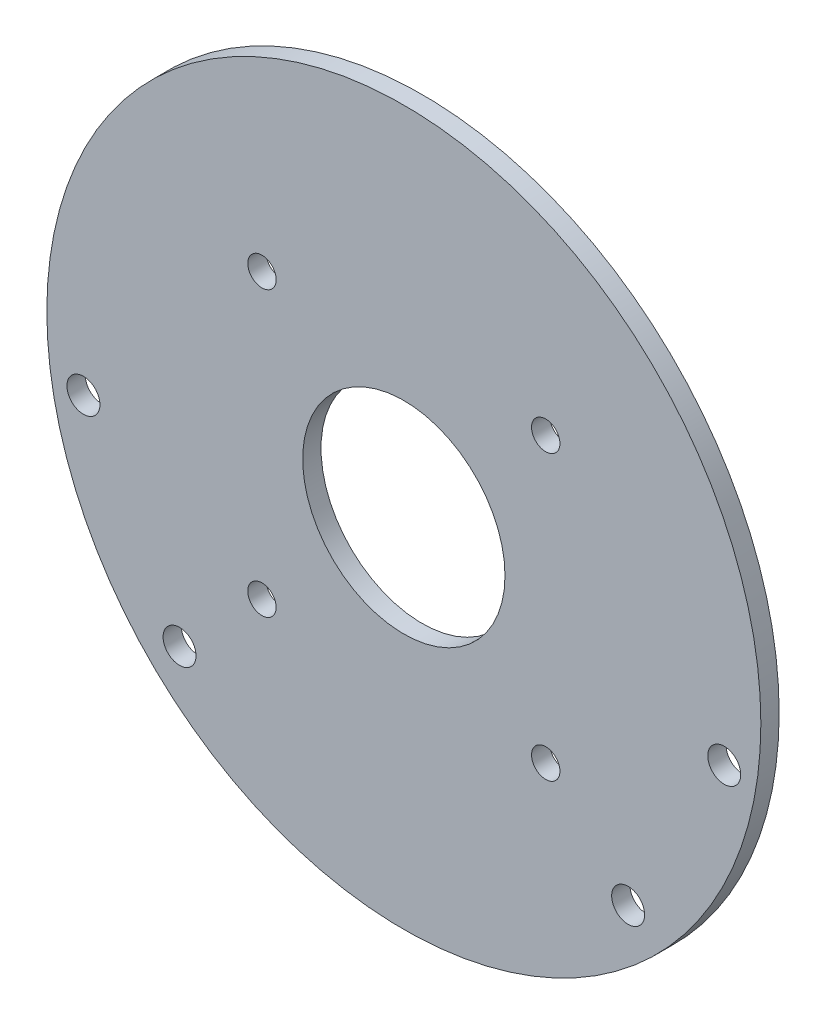
ISO-10303-21;
HEADER;
FILE_DESCRIPTION(('STEP AP214'),'2;1');
FILE_NAME('part.step','',(''),(''),'','','');
FILE_SCHEMA(('AUTOMOTIVE_DESIGN { 1 0 10303 214 1 1 1 1 }'));
ENDSEC;
DATA;
#1=APPLICATION_CONTEXT('core data for automotive mechanical design processes');
#2=APPLICATION_PROTOCOL_DEFINITION('international standard','automotive_design',2000,#1);
#3=PRODUCT_CONTEXT('',#1,'mechanical');
#4=PRODUCT('Part','Part','',(#3));
#5=PRODUCT_RELATED_PRODUCT_CATEGORY('part','',(#4));
#6=PRODUCT_DEFINITION_FORMATION('','',#4);
#7=PRODUCT_DEFINITION_CONTEXT('part definition',#1,'design');
#8=PRODUCT_DEFINITION('design','',#6,#7);
#9=PRODUCT_DEFINITION_SHAPE('','',#8);
#10=(LENGTH_UNIT() NAMED_UNIT(*) SI_UNIT(.MILLI.,.METRE.));
#11=(NAMED_UNIT(*) PLANE_ANGLE_UNIT() SI_UNIT($,.RADIAN.));
#12=(NAMED_UNIT(*) SI_UNIT($,.STERADIAN.) SOLID_ANGLE_UNIT());
#13=UNCERTAINTY_MEASURE_WITH_UNIT(LENGTH_MEASURE(1.E-05),#10,'distance_accuracy_value','');
#14=(GEOMETRIC_REPRESENTATION_CONTEXT(3) GLOBAL_UNCERTAINTY_ASSIGNED_CONTEXT((#13)) GLOBAL_UNIT_ASSIGNED_CONTEXT((#10,
#11,#12)) REPRESENTATION_CONTEXT('',''));
#15=CARTESIAN_POINT('',(0.,0.,0.));
#16=DIRECTION('',(0.,0.,1.));
#17=DIRECTION('',(1.,0.,0.));
#18=AXIS2_PLACEMENT_3D('',#15,#16,#17);
#19=CARTESIAN_POINT('',(0.,0.,2.));
#20=DIRECTION('',(0.,0.,-1.));
#21=DIRECTION('',(-1.,0.,0.));
#22=AXIS2_PLACEMENT_3D('',#19,#20,#21);
#23=CYLINDRICAL_SURFACE('',#22,39.);
#24=CARTESIAN_POINT('',(0.,0.,2.));
#25=DIRECTION('',(0.,0.,1.));
#26=DIRECTION('',(1.,0.,0.));
#27=AXIS2_PLACEMENT_3D('',#24,#25,#26);
#28=CIRCLE('',#27,39.);
#29=CARTESIAN_POINT('',(39.,0.,2.));
#30=VERTEX_POINT('',#29);
#31=EDGE_CURVE('E10',#30,#30,#28,.T.);
#32=ORIENTED_EDGE('',*,*,#31,.F.);
#33=EDGE_LOOP('',(#32));
#34=FACE_BOUND('',#33,.T.);
#35=CARTESIAN_POINT('',(0.,0.,0.));
#36=DIRECTION('',(0.,0.,1.));
#37=DIRECTION('',(1.,0.,0.));
#38=AXIS2_PLACEMENT_3D('',#35,#36,#37);
#39=CIRCLE('',#38,39.);
#40=CARTESIAN_POINT('',(39.,0.,0.));
#41=VERTEX_POINT('',#40);
#42=EDGE_CURVE('E40',#41,#41,#39,.T.);
#43=ORIENTED_EDGE('',*,*,#42,.T.);
#44=EDGE_LOOP('',(#43));
#45=FACE_BOUND('',#44,.T.);
#46=ADVANCED_FACE('F33',(#34,#45),#23,.T.);
#47=CARTESIAN_POINT('',(0.,0.,2.));
#48=DIRECTION('',(0.,0.,1.));
#49=DIRECTION('',(1.,0.,0.));
#50=AXIS2_PLACEMENT_3D('',#47,#48,#49);
#51=PLANE('',#50);
#52=CARTESIAN_POINT('',(-35.,-5.95906484185342,2.));
#53=DIRECTION('',(0.,0.,1.));
#54=DIRECTION('',(-1.,0.,0.));
#55=AXIS2_PLACEMENT_3D('',#52,#53,#54);
#56=CIRCLE('',#55,1.8);
#57=CARTESIAN_POINT('',(-36.8,-5.95906484185342,2.));
#58=VERTEX_POINT('',#57);
#59=EDGE_CURVE('E182',#58,#58,#56,.T.);
#60=ORIENTED_EDGE('',*,*,#59,.F.);
#61=EDGE_LOOP('',(#60));
#62=FACE_BOUND('',#61,.T.);
#63=CARTESIAN_POINT('',(35.,-5.95906484185342,2.));
#64=DIRECTION('',(0.,0.,1.));
#65=DIRECTION('',(1.,0.,0.));
#66=AXIS2_PLACEMENT_3D('',#63,#64,#65);
#67=CIRCLE('',#66,1.8);
#68=CARTESIAN_POINT('',(36.8,-5.95906484185342,2.));
#69=VERTEX_POINT('',#68);
#70=EDGE_CURVE('E178',#69,#69,#67,.T.);
#71=ORIENTED_EDGE('',*,*,#70,.F.);
#72=EDGE_LOOP('',(#71));
#73=FACE_BOUND('',#72,.T.);
#74=CARTESIAN_POINT('',(-24.5,-24.4590648418534,2.));
#75=DIRECTION('',(0.,0.,1.));
#76=DIRECTION('',(-1.,0.,0.));
#77=AXIS2_PLACEMENT_3D('',#74,#75,#76);
#78=CIRCLE('',#77,1.8);
#79=CARTESIAN_POINT('',(-26.3,-24.4590648418534,2.));
#80=VERTEX_POINT('',#79);
#81=EDGE_CURVE('E151',#80,#80,#78,.T.);
#82=ORIENTED_EDGE('',*,*,#81,.F.);
#83=EDGE_LOOP('',(#82));
#84=FACE_BOUND('',#83,.T.);
#85=CARTESIAN_POINT('',(24.5,-24.4590648418534,2.));
#86=DIRECTION('',(0.,0.,1.));
#87=DIRECTION('',(1.,0.,0.));
#88=AXIS2_PLACEMENT_3D('',#85,#86,#87);
#89=CIRCLE('',#88,1.8);
#90=CARTESIAN_POINT('',(26.3,-24.4590648418534,2.));
#91=VERTEX_POINT('',#90);
#92=EDGE_CURVE('E55',#91,#91,#89,.T.);
#93=ORIENTED_EDGE('',*,*,#92,.F.);
#94=EDGE_LOOP('',(#93));
#95=FACE_BOUND('',#94,.T.);
#96=CARTESIAN_POINT('',(0.,0.,2.));
#97=DIRECTION('',(0.,0.,1.));
#98=DIRECTION('',(1.,0.,0.));
#99=AXIS2_PLACEMENT_3D('',#96,#97,#98);
#100=CIRCLE('',#99,11.05);
#101=CARTESIAN_POINT('',(11.05,0.,2.));
#102=VERTEX_POINT('',#101);
#103=EDGE_CURVE('E62',#102,#102,#100,.T.);
#104=ORIENTED_EDGE('',*,*,#103,.F.);
#105=EDGE_LOOP('',(#104));
#106=FACE_BOUND('',#105,.T.);
#107=CARTESIAN_POINT('',(-15.5,15.5,2.));
#108=DIRECTION('',(0.,0.,1.));
#109=DIRECTION('',(1.,0.,0.));
#110=AXIS2_PLACEMENT_3D('',#107,#108,#109);
#111=CIRCLE('',#110,1.55);
#112=CARTESIAN_POINT('',(-13.95,15.5,2.));
#113=VERTEX_POINT('',#112);
#114=EDGE_CURVE('E71',#113,#113,#111,.T.);
#115=ORIENTED_EDGE('',*,*,#114,.F.);
#116=EDGE_LOOP('',(#115));
#117=FACE_BOUND('',#116,.T.);
#118=CARTESIAN_POINT('',(15.5,15.5,2.));
#119=DIRECTION('',(0.,0.,1.));
#120=DIRECTION('',(1.,0.,0.));
#121=AXIS2_PLACEMENT_3D('',#118,#119,#120);
#122=CIRCLE('',#121,1.55);
#123=CARTESIAN_POINT('',(17.05,15.5,2.));
#124=VERTEX_POINT('',#123);
#125=EDGE_CURVE('E84',#124,#124,#122,.T.);
#126=ORIENTED_EDGE('',*,*,#125,.F.);
#127=EDGE_LOOP('',(#126));
#128=FACE_BOUND('',#127,.T.);
#129=CARTESIAN_POINT('',(15.5,-15.5,2.));
#130=DIRECTION('',(0.,0.,1.));
#131=DIRECTION('',(1.,0.,0.));
#132=AXIS2_PLACEMENT_3D('',#129,#130,#131);
#133=CIRCLE('',#132,1.55);
#134=CARTESIAN_POINT('',(17.05,-15.5,2.));
#135=VERTEX_POINT('',#134);
#136=EDGE_CURVE('E78',#135,#135,#133,.T.);
#137=ORIENTED_EDGE('',*,*,#136,.F.);
#138=EDGE_LOOP('',(#137));
#139=FACE_BOUND('',#138,.T.);
#140=CARTESIAN_POINT('',(-15.5,-15.5,2.));
#141=DIRECTION('',(0.,0.,1.));
#142=DIRECTION('',(1.,0.,0.));
#143=AXIS2_PLACEMENT_3D('',#140,#141,#142);
#144=CIRCLE('',#143,1.55);
#145=CARTESIAN_POINT('',(-13.95,-15.5,2.));
#146=VERTEX_POINT('',#145);
#147=EDGE_CURVE('E48',#146,#146,#144,.T.);
#148=ORIENTED_EDGE('',*,*,#147,.F.);
#149=EDGE_LOOP('',(#148));
#150=FACE_BOUND('',#149,.T.);
#151=ORIENTED_EDGE('',*,*,#31,.T.);
#152=EDGE_LOOP('',(#151));
#153=FACE_BOUND('',#152,.T.);
#154=ADVANCED_FACE('F99',(#62,#73,#84,#95,#106,#117,#128,#139,#150,#153),#51,.T.);
#155=CARTESIAN_POINT('',(0.,0.,0.));
#156=DIRECTION('',(0.,0.,1.));
#157=DIRECTION('',(1.,0.,0.));
#158=AXIS2_PLACEMENT_3D('',#155,#156,#157);
#159=PLANE('',#158);
#160=CARTESIAN_POINT('',(-35.,-5.95906484185342,0.));
#161=DIRECTION('',(0.,0.,1.));
#162=DIRECTION('',(1.,0.,0.));
#163=AXIS2_PLACEMENT_3D('',#160,#161,#162);
#164=CIRCLE('',#163,1.8);
#165=CARTESIAN_POINT('',(-33.2,-5.95906484185342,0.));
#166=VERTEX_POINT('',#165);
#167=EDGE_CURVE('E36',#166,#166,#164,.T.);
#168=ORIENTED_EDGE('',*,*,#167,.T.);
#169=EDGE_LOOP('',(#168));
#170=FACE_BOUND('',#169,.T.);
#171=CARTESIAN_POINT('',(35.,-5.95906484185342,0.));
#172=DIRECTION('',(0.,0.,1.));
#173=DIRECTION('',(1.,0.,0.));
#174=AXIS2_PLACEMENT_3D('',#171,#172,#173);
#175=CIRCLE('',#174,1.8);
#176=CARTESIAN_POINT('',(36.8,-5.95906484185342,0.));
#177=VERTEX_POINT('',#176);
#178=EDGE_CURVE('E57',#177,#177,#175,.T.);
#179=ORIENTED_EDGE('',*,*,#178,.T.);
#180=EDGE_LOOP('',(#179));
#181=FACE_BOUND('',#180,.T.);
#182=CARTESIAN_POINT('',(-24.5,-24.4590648418534,0.));
#183=DIRECTION('',(0.,0.,1.));
#184=DIRECTION('',(1.,0.,0.));
#185=AXIS2_PLACEMENT_3D('',#182,#183,#184);
#186=CIRCLE('',#185,1.8);
#187=CARTESIAN_POINT('',(-22.7,-24.4590648418534,0.));
#188=VERTEX_POINT('',#187);
#189=EDGE_CURVE('E54',#188,#188,#186,.T.);
#190=ORIENTED_EDGE('',*,*,#189,.T.);
#191=EDGE_LOOP('',(#190));
#192=FACE_BOUND('',#191,.T.);
#193=CARTESIAN_POINT('',(24.5,-24.4590648418534,0.));
#194=DIRECTION('',(0.,0.,1.));
#195=DIRECTION('',(1.,0.,0.));
#196=AXIS2_PLACEMENT_3D('',#193,#194,#195);
#197=CIRCLE('',#196,1.8);
#198=CARTESIAN_POINT('',(26.3,-24.4590648418534,0.));
#199=VERTEX_POINT('',#198);
#200=EDGE_CURVE('E51',#199,#199,#197,.T.);
#201=ORIENTED_EDGE('',*,*,#200,.T.);
#202=EDGE_LOOP('',(#201));
#203=FACE_BOUND('',#202,.T.);
#204=CARTESIAN_POINT('',(0.,0.,0.));
#205=DIRECTION('',(0.,0.,1.));
#206=DIRECTION('',(1.,0.,0.));
#207=AXIS2_PLACEMENT_3D('',#204,#205,#206);
#208=CIRCLE('',#207,11.05);
#209=CARTESIAN_POINT('',(11.05,0.,0.));
#210=VERTEX_POINT('',#209);
#211=EDGE_CURVE('E66',#210,#210,#208,.T.);
#212=ORIENTED_EDGE('',*,*,#211,.T.);
#213=EDGE_LOOP('',(#212));
#214=FACE_BOUND('',#213,.T.);
#215=CARTESIAN_POINT('',(-15.5,15.5,0.));
#216=DIRECTION('',(0.,0.,1.));
#217=DIRECTION('',(1.,0.,0.));
#218=AXIS2_PLACEMENT_3D('',#215,#216,#217);
#219=CIRCLE('',#218,1.55);
#220=CARTESIAN_POINT('',(-13.95,15.5,0.));
#221=VERTEX_POINT('',#220);
#222=EDGE_CURVE('E87',#221,#221,#219,.T.);
#223=ORIENTED_EDGE('',*,*,#222,.T.);
#224=EDGE_LOOP('',(#223));
#225=FACE_BOUND('',#224,.T.);
#226=CARTESIAN_POINT('',(15.5,15.5,0.));
#227=DIRECTION('',(0.,0.,1.));
#228=DIRECTION('',(1.,0.,0.));
#229=AXIS2_PLACEMENT_3D('',#226,#227,#228);
#230=CIRCLE('',#229,1.55);
#231=CARTESIAN_POINT('',(17.05,15.5,0.));
#232=VERTEX_POINT('',#231);
#233=EDGE_CURVE('E81',#232,#232,#230,.T.);
#234=ORIENTED_EDGE('',*,*,#233,.T.);
#235=EDGE_LOOP('',(#234));
#236=FACE_BOUND('',#235,.T.);
#237=CARTESIAN_POINT('',(15.5,-15.5,0.));
#238=DIRECTION('',(0.,0.,1.));
#239=DIRECTION('',(1.,0.,0.));
#240=AXIS2_PLACEMENT_3D('',#237,#238,#239);
#241=CIRCLE('',#240,1.55);
#242=CARTESIAN_POINT('',(17.05,-15.5,0.));
#243=VERTEX_POINT('',#242);
#244=EDGE_CURVE('E75',#243,#243,#241,.T.);
#245=ORIENTED_EDGE('',*,*,#244,.T.);
#246=EDGE_LOOP('',(#245));
#247=FACE_BOUND('',#246,.T.);
#248=CARTESIAN_POINT('',(-15.5,-15.5,0.));
#249=DIRECTION('',(0.,0.,1.));
#250=DIRECTION('',(1.,0.,0.));
#251=AXIS2_PLACEMENT_3D('',#248,#249,#250);
#252=CIRCLE('',#251,1.55);
#253=CARTESIAN_POINT('',(-13.95,-15.5,0.));
#254=VERTEX_POINT('',#253);
#255=EDGE_CURVE('E45',#254,#254,#252,.T.);
#256=ORIENTED_EDGE('',*,*,#255,.T.);
#257=EDGE_LOOP('',(#256));
#258=FACE_BOUND('',#257,.T.);
#259=ORIENTED_EDGE('',*,*,#42,.F.);
#260=EDGE_LOOP('',(#259));
#261=FACE_BOUND('',#260,.T.);
#262=ADVANCED_FACE('F101',(#170,#181,#192,#203,#214,#225,#236,#247,#258,#261),#159,.F.);
#263=CARTESIAN_POINT('',(-15.5,-15.5,0.));
#264=DIRECTION('',(0.,0.,1.));
#265=DIRECTION('',(1.,0.,0.));
#266=AXIS2_PLACEMENT_3D('',#263,#264,#265);
#267=CYLINDRICAL_SURFACE('',#266,1.55);
#268=ORIENTED_EDGE('',*,*,#255,.F.);
#269=EDGE_LOOP('',(#268));
#270=FACE_BOUND('',#269,.T.);
#271=ORIENTED_EDGE('',*,*,#147,.T.);
#272=EDGE_LOOP('',(#271));
#273=FACE_BOUND('',#272,.T.);
#274=ADVANCED_FACE('F97',(#270,#273),#267,.F.);
#275=CARTESIAN_POINT('',(15.5,-15.5,0.));
#276=DIRECTION('',(0.,0.,1.));
#277=DIRECTION('',(1.,0.,0.));
#278=AXIS2_PLACEMENT_3D('',#275,#276,#277);
#279=CYLINDRICAL_SURFACE('',#278,1.55);
#280=ORIENTED_EDGE('',*,*,#244,.F.);
#281=EDGE_LOOP('',(#280));
#282=FACE_BOUND('',#281,.T.);
#283=ORIENTED_EDGE('',*,*,#136,.T.);
#284=EDGE_LOOP('',(#283));
#285=FACE_BOUND('',#284,.T.);
#286=ADVANCED_FACE('F114',(#282,#285),#279,.F.);
#287=CARTESIAN_POINT('',(15.5,15.5,0.));
#288=DIRECTION('',(0.,0.,1.));
#289=DIRECTION('',(1.,0.,0.));
#290=AXIS2_PLACEMENT_3D('',#287,#288,#289);
#291=CYLINDRICAL_SURFACE('',#290,1.55);
#292=ORIENTED_EDGE('',*,*,#233,.F.);
#293=EDGE_LOOP('',(#292));
#294=FACE_BOUND('',#293,.T.);
#295=ORIENTED_EDGE('',*,*,#125,.T.);
#296=EDGE_LOOP('',(#295));
#297=FACE_BOUND('',#296,.T.);
#298=ADVANCED_FACE('F120',(#294,#297),#291,.F.);
#299=CARTESIAN_POINT('',(-15.5,15.5,0.));
#300=DIRECTION('',(0.,0.,1.));
#301=DIRECTION('',(1.,0.,0.));
#302=AXIS2_PLACEMENT_3D('',#299,#300,#301);
#303=CYLINDRICAL_SURFACE('',#302,1.55);
#304=ORIENTED_EDGE('',*,*,#222,.F.);
#305=EDGE_LOOP('',(#304));
#306=FACE_BOUND('',#305,.T.);
#307=ORIENTED_EDGE('',*,*,#114,.T.);
#308=EDGE_LOOP('',(#307));
#309=FACE_BOUND('',#308,.T.);
#310=ADVANCED_FACE('F116',(#306,#309),#303,.F.);
#311=CARTESIAN_POINT('',(0.,0.,0.));
#312=DIRECTION('',(0.,0.,1.));
#313=DIRECTION('',(1.,0.,0.));
#314=AXIS2_PLACEMENT_3D('',#311,#312,#313);
#315=CYLINDRICAL_SURFACE('',#314,11.05);
#316=ORIENTED_EDGE('',*,*,#211,.F.);
#317=EDGE_LOOP('',(#316));
#318=FACE_BOUND('',#317,.T.);
#319=ORIENTED_EDGE('',*,*,#103,.T.);
#320=EDGE_LOOP('',(#319));
#321=FACE_BOUND('',#320,.T.);
#322=ADVANCED_FACE('F119',(#318,#321),#315,.F.);
#323=CARTESIAN_POINT('',(24.5,-24.4590648418534,-8.));
#324=DIRECTION('',(0.,0.,1.));
#325=DIRECTION('',(1.,0.,0.));
#326=AXIS2_PLACEMENT_3D('',#323,#324,#325);
#327=CYLINDRICAL_SURFACE('',#326,1.8);
#328=ORIENTED_EDGE('',*,*,#92,.T.);
#329=EDGE_LOOP('',(#328));
#330=FACE_BOUND('',#329,.T.);
#331=ORIENTED_EDGE('',*,*,#200,.F.);
#332=EDGE_LOOP('',(#331));
#333=FACE_BOUND('',#332,.T.);
#334=ADVANCED_FACE('F130',(#330,#333),#327,.F.);
#335=CARTESIAN_POINT('',(-24.5,-24.4590648418534,-8.));
#336=DIRECTION('',(0.,0.,1.));
#337=DIRECTION('',(1.,0.,0.));
#338=AXIS2_PLACEMENT_3D('',#335,#336,#337);
#339=CYLINDRICAL_SURFACE('',#338,1.8);
#340=ORIENTED_EDGE('',*,*,#81,.T.);
#341=EDGE_LOOP('',(#340));
#342=FACE_BOUND('',#341,.T.);
#343=ORIENTED_EDGE('',*,*,#189,.F.);
#344=EDGE_LOOP('',(#343));
#345=FACE_BOUND('',#344,.T.);
#346=ADVANCED_FACE('F134',(#342,#345),#339,.F.);
#347=CARTESIAN_POINT('',(35.,-5.95906484185342,-8.));
#348=DIRECTION('',(0.,0.,1.));
#349=DIRECTION('',(1.,0.,0.));
#350=AXIS2_PLACEMENT_3D('',#347,#348,#349);
#351=CYLINDRICAL_SURFACE('',#350,1.8);
#352=ORIENTED_EDGE('',*,*,#70,.T.);
#353=EDGE_LOOP('',(#352));
#354=FACE_BOUND('',#353,.T.);
#355=ORIENTED_EDGE('',*,*,#178,.F.);
#356=EDGE_LOOP('',(#355));
#357=FACE_BOUND('',#356,.T.);
#358=ADVANCED_FACE('F139',(#354,#357),#351,.F.);
#359=CARTESIAN_POINT('',(-35.,-5.95906484185342,-8.));
#360=DIRECTION('',(0.,0.,1.));
#361=DIRECTION('',(1.,0.,0.));
#362=AXIS2_PLACEMENT_3D('',#359,#360,#361);
#363=CYLINDRICAL_SURFACE('',#362,1.8);
#364=ORIENTED_EDGE('',*,*,#59,.T.);
#365=EDGE_LOOP('',(#364));
#366=FACE_BOUND('',#365,.T.);
#367=ORIENTED_EDGE('',*,*,#167,.F.);
#368=EDGE_LOOP('',(#367));
#369=FACE_BOUND('',#368,.T.);
#370=ADVANCED_FACE('F136',(#366,#369),#363,.F.);
#371=CLOSED_SHELL('',(#46,#154,#262,#274,#286,#298,#310,#322,#334,#346,#358,#370));
#372=MANIFOLD_SOLID_BREP('B2',#371);
#373=ADVANCED_BREP_SHAPE_REPRESENTATION('',(#18,#372),#14);
#374=SHAPE_DEFINITION_REPRESENTATION(#9,#373);
ENDSEC;
END-ISO-10303-21;
